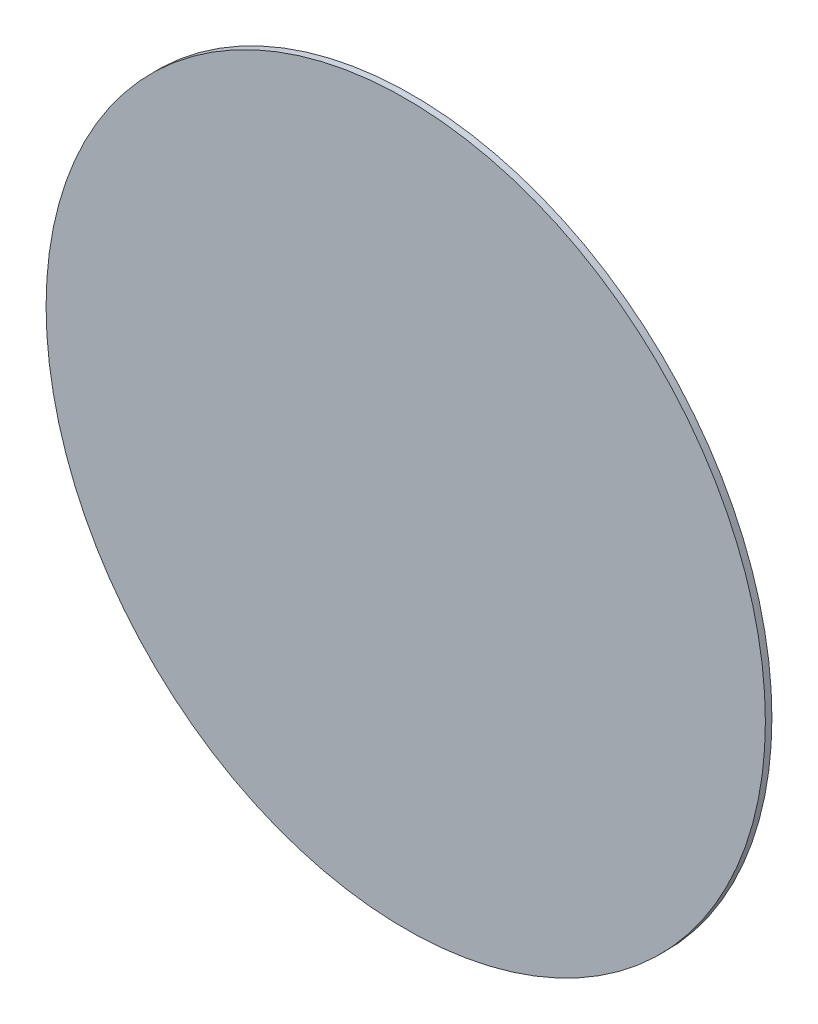
ISO-10303-21;
HEADER;
FILE_DESCRIPTION(('STEP AP214'),'2;1');
FILE_NAME('part.step','',(''),(''),'','','');
FILE_SCHEMA(('AUTOMOTIVE_DESIGN { 1 0 10303 214 1 1 1 1 }'));
ENDSEC;
DATA;
#1=APPLICATION_CONTEXT('core data for automotive mechanical design processes');
#2=APPLICATION_PROTOCOL_DEFINITION('international standard','automotive_design',2000,#1);
#3=PRODUCT_CONTEXT('',#1,'mechanical');
#4=PRODUCT('Part','Part','',(#3));
#5=PRODUCT_RELATED_PRODUCT_CATEGORY('part','',(#4));
#6=PRODUCT_DEFINITION_FORMATION('','',#4);
#7=PRODUCT_DEFINITION_CONTEXT('part definition',#1,'design');
#8=PRODUCT_DEFINITION('design','',#6,#7);
#9=PRODUCT_DEFINITION_SHAPE('','',#8);
#10=(LENGTH_UNIT() NAMED_UNIT(*) SI_UNIT(.MILLI.,.METRE.));
#11=(NAMED_UNIT(*) PLANE_ANGLE_UNIT() SI_UNIT($,.RADIAN.));
#12=(NAMED_UNIT(*) SI_UNIT($,.STERADIAN.) SOLID_ANGLE_UNIT());
#13=UNCERTAINTY_MEASURE_WITH_UNIT(LENGTH_MEASURE(1.E-05),#10,'distance_accuracy_value','');
#14=(GEOMETRIC_REPRESENTATION_CONTEXT(3) GLOBAL_UNCERTAINTY_ASSIGNED_CONTEXT((#13)) GLOBAL_UNIT_ASSIGNED_CONTEXT((#10,
#11,#12)) REPRESENTATION_CONTEXT('',''));
#15=CARTESIAN_POINT('',(0.,0.,0.));
#16=DIRECTION('',(0.,0.,1.));
#17=DIRECTION('',(1.,0.,0.));
#18=AXIS2_PLACEMENT_3D('',#15,#16,#17);
#19=CARTESIAN_POINT('',(0.,0.,10.));
#20=DIRECTION('',(0.,0.,-1.));
#21=DIRECTION('',(-1.,0.,0.));
#22=AXIS2_PLACEMENT_3D('',#19,#20,#21);
#23=CYLINDRICAL_SURFACE('',#22,550.);
#24=CARTESIAN_POINT('',(0.,0.,10.));
#25=DIRECTION('',(0.,0.,1.));
#26=DIRECTION('',(1.,0.,0.));
#27=AXIS2_PLACEMENT_3D('',#24,#25,#26);
#28=CIRCLE('',#27,550.);
#29=CARTESIAN_POINT('',(550.,0.,10.));
#30=VERTEX_POINT('',#29);
#31=EDGE_CURVE('E10',#30,#30,#28,.T.);
#32=ORIENTED_EDGE('',*,*,#31,.F.);
#33=EDGE_LOOP('',(#32));
#34=FACE_BOUND('',#33,.T.);
#35=CARTESIAN_POINT('',(0.,0.,0.));
#36=DIRECTION('',(0.,0.,1.));
#37=DIRECTION('',(1.,0.,0.));
#38=AXIS2_PLACEMENT_3D('',#35,#36,#37);
#39=CIRCLE('',#38,550.);
#40=CARTESIAN_POINT('',(550.,0.,0.));
#41=VERTEX_POINT('',#40);
#42=EDGE_CURVE('E39',#41,#41,#39,.T.);
#43=ORIENTED_EDGE('',*,*,#42,.T.);
#44=EDGE_LOOP('',(#43));
#45=FACE_BOUND('',#44,.T.);
#46=ADVANCED_FACE('F36',(#34,#45),#23,.T.);
#47=CARTESIAN_POINT('',(0.,0.,10.));
#48=DIRECTION('',(0.,0.,1.));
#49=DIRECTION('',(1.,0.,0.));
#50=AXIS2_PLACEMENT_3D('',#47,#48,#49);
#51=PLANE('',#50);
#52=ORIENTED_EDGE('',*,*,#31,.T.);
#53=EDGE_LOOP('',(#52));
#54=FACE_BOUND('',#53,.T.);
#55=ADVANCED_FACE('F53',(#54),#51,.T.);
#56=CARTESIAN_POINT('',(0.,0.,0.));
#57=DIRECTION('',(0.,0.,1.));
#58=DIRECTION('',(1.,0.,0.));
#59=AXIS2_PLACEMENT_3D('',#56,#57,#58);
#60=PLANE('',#59);
#61=ORIENTED_EDGE('',*,*,#42,.F.);
#62=EDGE_LOOP('',(#61));
#63=FACE_BOUND('',#62,.T.);
#64=ADVANCED_FACE('F51',(#63),#60,.F.);
#65=CLOSED_SHELL('',(#46,#55,#64));
#66=MANIFOLD_SOLID_BREP('B2',#65);
#67=ADVANCED_BREP_SHAPE_REPRESENTATION('',(#18,#66),#14);
#68=SHAPE_DEFINITION_REPRESENTATION(#9,#67);
ENDSEC;
END-ISO-10303-21;
